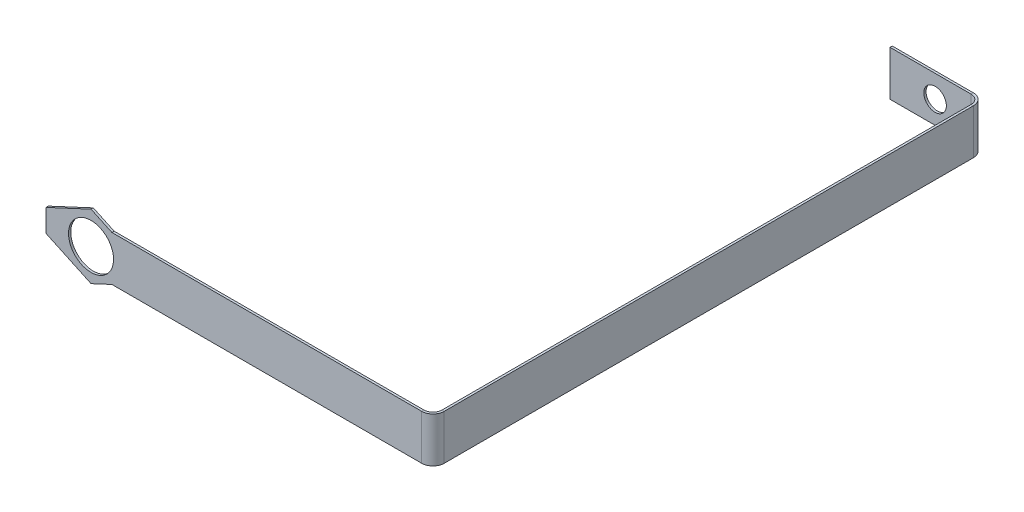
ISO-10303-21;
HEADER;
FILE_DESCRIPTION(('STEP AP214'),'2;1');
FILE_NAME('part.step','',(''),(''),'','','');
FILE_SCHEMA(('AUTOMOTIVE_DESIGN { 1 0 10303 214 1 1 1 1 }'));
ENDSEC;
DATA;
#1=APPLICATION_CONTEXT('core data for automotive mechanical design processes');
#2=APPLICATION_PROTOCOL_DEFINITION('international standard','automotive_design',2000,#1);
#3=PRODUCT_CONTEXT('',#1,'mechanical');
#4=PRODUCT('Part','Part','',(#3));
#5=PRODUCT_RELATED_PRODUCT_CATEGORY('part','',(#4));
#6=PRODUCT_DEFINITION_FORMATION('','',#4);
#7=PRODUCT_DEFINITION_CONTEXT('part definition',#1,'design');
#8=PRODUCT_DEFINITION('design','',#6,#7);
#9=PRODUCT_DEFINITION_SHAPE('','',#8);
#10=(LENGTH_UNIT() NAMED_UNIT(*) SI_UNIT(.MILLI.,.METRE.));
#11=(NAMED_UNIT(*) PLANE_ANGLE_UNIT() SI_UNIT($,.RADIAN.));
#12=(NAMED_UNIT(*) SI_UNIT($,.STERADIAN.) SOLID_ANGLE_UNIT());
#13=UNCERTAINTY_MEASURE_WITH_UNIT(LENGTH_MEASURE(1.E-05),#10,'distance_accuracy_value','');
#14=(GEOMETRIC_REPRESENTATION_CONTEXT(3) GLOBAL_UNCERTAINTY_ASSIGNED_CONTEXT((#13)) GLOBAL_UNIT_ASSIGNED_CONTEXT((#10,
#11,#12)) REPRESENTATION_CONTEXT('',''));
#15=CARTESIAN_POINT('',(0.,0.,0.));
#16=DIRECTION('',(0.,0.,1.));
#17=DIRECTION('',(1.,0.,0.));
#18=AXIS2_PLACEMENT_3D('',#15,#16,#17);
#19=CARTESIAN_POINT('',(8.20000000000001,4.,49.));
#20=DIRECTION('',(0.,1.,0.));
#21=DIRECTION('',(1.,0.,0.));
#22=AXIS2_PLACEMENT_3D('',#19,#20,#21);
#23=PLANE('',#22);
#24=DIRECTION('',(-1.,0.,0.));
#25=VECTOR('',#24,1.);
#26=CARTESIAN_POINT('',(8.20000000000001,4.,48.8));
#27=LINE('',#26,#25);
#28=CARTESIAN_POINT('',(-20.3145069205096,4.,48.8));
#29=VERTEX_POINT('',#28);
#30=CARTESIAN_POINT('',(7.2,4.,48.8));
#31=VERTEX_POINT('',#30);
#32=EDGE_CURVE('E68',#29,#31,#27,.F.);
#33=ORIENTED_EDGE('',*,*,#32,.F.);
#34=DIRECTION('',(0.,0.,1.));
#35=VECTOR('',#34,1.);
#36=CARTESIAN_POINT('',(-20.3145069205096,4.,48.8));
#37=LINE('',#36,#35);
#38=CARTESIAN_POINT('',(-20.3145069205096,4.,49.));
#39=VERTEX_POINT('',#38);
#40=EDGE_CURVE('E192',#29,#39,#37,.T.);
#41=ORIENTED_EDGE('',*,*,#40,.T.);
#42=DIRECTION('',(1.,0.,0.));
#43=VECTOR('',#42,1.);
#44=CARTESIAN_POINT('',(8.20000000000001,4.,49.));
#45=LINE('',#44,#43);
#46=CARTESIAN_POINT('',(7.2,4.,49.));
#47=VERTEX_POINT('',#46);
#48=EDGE_CURVE('E266',#39,#47,#45,.T.);
#49=ORIENTED_EDGE('',*,*,#48,.T.);
#50=DIRECTION('',(0.,0.,1.));
#51=VECTOR('',#50,1.);
#52=CARTESIAN_POINT('',(7.2,4.,49.));
#53=LINE('',#52,#51);
#54=EDGE_CURVE('E285',#31,#47,#53,.T.);
#55=ORIENTED_EDGE('',*,*,#54,.F.);
#56=EDGE_LOOP('',(#33,#41,#49,#55));
#57=FACE_BOUND('',#56,.T.);
#58=ADVANCED_FACE('F53',(#57),#23,.T.);
#59=CARTESIAN_POINT('',(8.2,0.,0.));
#60=DIRECTION('',(0.,1.,0.));
#61=DIRECTION('',(0.,0.,-1.));
#62=AXIS2_PLACEMENT_3D('',#59,#60,#61);
#63=PLANE('',#62);
#64=DIRECTION('',(1.,0.,0.));
#65=VECTOR('',#64,1.);
#66=CARTESIAN_POINT('',(8.2,0.,48.));
#67=LINE('',#66,#65);
#68=CARTESIAN_POINT('',(8.,0.,48.));
#69=VERTEX_POINT('',#68);
#70=CARTESIAN_POINT('',(8.2,0.,48.));
#71=VERTEX_POINT('',#70);
#72=EDGE_CURVE('E318',#69,#71,#67,.T.);
#73=ORIENTED_EDGE('',*,*,#72,.F.);
#74=DIRECTION('',(0.,0.,1.));
#75=VECTOR('',#74,1.);
#76=CARTESIAN_POINT('',(8.,0.,0.));
#77=LINE('',#76,#75);
#78=CARTESIAN_POINT('',(8.,0.,1.));
#79=VERTEX_POINT('',#78);
#80=EDGE_CURVE('E297',#69,#79,#77,.F.);
#81=ORIENTED_EDGE('',*,*,#80,.T.);
#82=DIRECTION('',(1.,0.,0.));
#83=VECTOR('',#82,1.);
#84=CARTESIAN_POINT('',(8.2,0.,1.));
#85=LINE('',#84,#83);
#86=CARTESIAN_POINT('',(8.2,0.,1.));
#87=VERTEX_POINT('',#86);
#88=EDGE_CURVE('E324',#79,#87,#85,.T.);
#89=ORIENTED_EDGE('',*,*,#88,.T.);
#90=DIRECTION('',(0.,0.,-1.));
#91=VECTOR('',#90,1.);
#92=CARTESIAN_POINT('',(8.2,0.,0.));
#93=LINE('',#92,#91);
#94=EDGE_CURVE('E302',#71,#87,#93,.T.);
#95=ORIENTED_EDGE('',*,*,#94,.F.);
#96=EDGE_LOOP('',(#73,#81,#89,#95));
#97=FACE_BOUND('',#96,.T.);
#98=ADVANCED_FACE('F55',(#97),#63,.F.);
#99=CARTESIAN_POINT('',(8.2,4.,0.));
#100=DIRECTION('',(0.,1.,0.));
#101=DIRECTION('',(0.,0.,-1.));
#102=AXIS2_PLACEMENT_3D('',#99,#100,#101);
#103=PLANE('',#102);
#104=DIRECTION('',(1.,0.,0.));
#105=VECTOR('',#104,1.);
#106=CARTESIAN_POINT('',(8.2,4.,1.));
#107=LINE('',#106,#105);
#108=CARTESIAN_POINT('',(8.,4.,1.));
#109=VERTEX_POINT('',#108);
#110=CARTESIAN_POINT('',(8.2,4.,1.));
#111=VERTEX_POINT('',#110);
#112=EDGE_CURVE('E11',#109,#111,#107,.T.);
#113=ORIENTED_EDGE('',*,*,#112,.F.);
#114=DIRECTION('',(0.,0.,1.));
#115=VECTOR('',#114,1.);
#116=CARTESIAN_POINT('',(8.,4.,0.));
#117=LINE('',#116,#115);
#118=CARTESIAN_POINT('',(8.,4.,48.));
#119=VERTEX_POINT('',#118);
#120=EDGE_CURVE('E305',#119,#109,#117,.F.);
#121=ORIENTED_EDGE('',*,*,#120,.F.);
#122=DIRECTION('',(1.,0.,0.));
#123=VECTOR('',#122,1.);
#124=CARTESIAN_POINT('',(8.2,4.,48.));
#125=LINE('',#124,#123);
#126=CARTESIAN_POINT('',(8.2,4.,48.));
#127=VERTEX_POINT('',#126);
#128=EDGE_CURVE('E312',#119,#127,#125,.T.);
#129=ORIENTED_EDGE('',*,*,#128,.T.);
#130=DIRECTION('',(0.,0.,-1.));
#131=VECTOR('',#130,1.);
#132=CARTESIAN_POINT('',(8.2,4.,0.));
#133=LINE('',#132,#131);
#134=EDGE_CURVE('E304',#127,#111,#133,.T.);
#135=ORIENTED_EDGE('',*,*,#134,.T.);
#136=EDGE_LOOP('',(#113,#121,#129,#135));
#137=FACE_BOUND('',#136,.T.);
#138=ADVANCED_FACE('F365',(#137),#103,.T.);
#139=CARTESIAN_POINT('',(8.2,4.,0.));
#140=DIRECTION('',(-1.,0.,0.));
#141=DIRECTION('',(0.,0.,1.));
#142=AXIS2_PLACEMENT_3D('',#139,#140,#141);
#143=PLANE('',#142);
#144=ORIENTED_EDGE('',*,*,#94,.T.);
#145=DIRECTION('',(0.,1.,0.));
#146=VECTOR('',#145,1.);
#147=CARTESIAN_POINT('',(8.2,4.,1.));
#148=LINE('',#147,#146);
#149=EDGE_CURVE('E321',#87,#111,#148,.T.);
#150=ORIENTED_EDGE('',*,*,#149,.T.);
#151=ORIENTED_EDGE('',*,*,#134,.F.);
#152=DIRECTION('',(0.,-1.,0.));
#153=VECTOR('',#152,1.);
#154=CARTESIAN_POINT('',(8.2,4.,48.));
#155=LINE('',#154,#153);
#156=EDGE_CURVE('E307',#127,#71,#155,.T.);
#157=ORIENTED_EDGE('',*,*,#156,.T.);
#158=EDGE_LOOP('',(#144,#150,#151,#157));
#159=FACE_BOUND('',#158,.T.);
#160=ADVANCED_FACE('F369',(#159),#143,.F.);
#161=CARTESIAN_POINT('',(8.,4.,0.));
#162=DIRECTION('',(-1.,0.,0.));
#163=DIRECTION('',(0.,0.,1.));
#164=AXIS2_PLACEMENT_3D('',#161,#162,#163);
#165=PLANE('',#164);
#166=ORIENTED_EDGE('',*,*,#80,.F.);
#167=DIRECTION('',(0.,-1.,0.));
#168=VECTOR('',#167,1.);
#169=CARTESIAN_POINT('',(8.,4.,48.));
#170=LINE('',#169,#168);
#171=EDGE_CURVE('E315',#119,#69,#170,.T.);
#172=ORIENTED_EDGE('',*,*,#171,.F.);
#173=ORIENTED_EDGE('',*,*,#120,.T.);
#174=DIRECTION('',(0.,1.,0.));
#175=VECTOR('',#174,1.);
#176=CARTESIAN_POINT('',(8.,4.,1.));
#177=LINE('',#176,#175);
#178=EDGE_CURVE('E61',#79,#109,#177,.T.);
#179=ORIENTED_EDGE('',*,*,#178,.F.);
#180=EDGE_LOOP('',(#166,#172,#173,#179));
#181=FACE_BOUND('',#180,.T.);
#182=ADVANCED_FACE('F334',(#181),#165,.T.);
#183=CARTESIAN_POINT('',(7.2,0.,48.));
#184=DIRECTION('',(0.,-1.,0.));
#185=DIRECTION('',(0.,0.,-1.));
#186=AXIS2_PLACEMENT_3D('',#183,#184,#185);
#187=PLANE('',#186);
#188=DIRECTION('',(0.,0.,1.));
#189=VECTOR('',#188,1.);
#190=CARTESIAN_POINT('',(7.2,0.,49.));
#191=LINE('',#190,#189);
#192=CARTESIAN_POINT('',(7.2,0.,48.8));
#193=VERTEX_POINT('',#192);
#194=CARTESIAN_POINT('',(7.2,0.,49.));
#195=VERTEX_POINT('',#194);
#196=EDGE_CURVE('E259',#193,#195,#191,.T.);
#197=ORIENTED_EDGE('',*,*,#196,.F.);
#198=CARTESIAN_POINT('',(7.2,0.,48.));
#199=DIRECTION('',(0.,-1.,0.));
#200=DIRECTION('',(0.,0.,-1.));
#201=AXIS2_PLACEMENT_3D('',#198,#199,#200);
#202=CIRCLE('',#201,0.8);
#203=EDGE_CURVE('E262',#193,#69,#202,.F.);
#204=ORIENTED_EDGE('',*,*,#203,.T.);
#205=ORIENTED_EDGE('',*,*,#72,.T.);
#206=CARTESIAN_POINT('',(7.2,0.,48.));
#207=DIRECTION('',(0.,1.,0.));
#208=DIRECTION('',(0.,0.,1.));
#209=AXIS2_PLACEMENT_3D('',#206,#207,#208);
#210=CIRCLE('',#209,1.);
#211=EDGE_CURVE('E290',#195,#71,#210,.T.);
#212=ORIENTED_EDGE('',*,*,#211,.F.);
#213=EDGE_LOOP('',(#197,#204,#205,#212));
#214=FACE_BOUND('',#213,.T.);
#215=ADVANCED_FACE('F351',(#214),#187,.T.);
#216=CARTESIAN_POINT('',(7.2,4.,48.));
#217=DIRECTION('',(0.,1.,0.));
#218=DIRECTION('',(0.,0.,1.));
#219=AXIS2_PLACEMENT_3D('',#216,#217,#218);
#220=PLANE('',#219);
#221=ORIENTED_EDGE('',*,*,#128,.F.);
#222=CARTESIAN_POINT('',(7.2,4.,48.));
#223=DIRECTION('',(0.,-1.,0.));
#224=DIRECTION('',(0.,0.,-1.));
#225=AXIS2_PLACEMENT_3D('',#222,#223,#224);
#226=CIRCLE('',#225,0.8);
#227=EDGE_CURVE('E294',#119,#31,#226,.T.);
#228=ORIENTED_EDGE('',*,*,#227,.T.);
#229=ORIENTED_EDGE('',*,*,#54,.T.);
#230=CARTESIAN_POINT('',(7.2,4.,48.));
#231=DIRECTION('',(0.,-1.,0.));
#232=DIRECTION('',(0.,0.,-1.));
#233=AXIS2_PLACEMENT_3D('',#230,#231,#232);
#234=CIRCLE('',#233,1.);
#235=EDGE_CURVE('E293',#127,#47,#234,.T.);
#236=ORIENTED_EDGE('',*,*,#235,.F.);
#237=EDGE_LOOP('',(#221,#228,#229,#236));
#238=FACE_BOUND('',#237,.T.);
#239=ADVANCED_FACE('F362',(#238),#220,.T.);
#240=CARTESIAN_POINT('',(7.2,6.24718670312721,48.));
#241=DIRECTION('',(0.,-1.,0.));
#242=DIRECTION('',(0.,0.,-1.));
#243=AXIS2_PLACEMENT_3D('',#240,#241,#242);
#244=CYLINDRICAL_SURFACE('',#243,1.);
#245=ORIENTED_EDGE('',*,*,#235,.T.);
#246=DIRECTION('',(0.,1.,0.));
#247=VECTOR('',#246,1.);
#248=CARTESIAN_POINT('',(7.2,4.,49.));
#249=LINE('',#248,#247);
#250=EDGE_CURVE('E268',#195,#47,#249,.T.);
#251=ORIENTED_EDGE('',*,*,#250,.F.);
#252=ORIENTED_EDGE('',*,*,#211,.T.);
#253=ORIENTED_EDGE('',*,*,#156,.F.);
#254=EDGE_LOOP('',(#245,#251,#252,#253));
#255=FACE_BOUND('',#254,.T.);
#256=ADVANCED_FACE('F367',(#255),#244,.T.);
#257=CARTESIAN_POINT('',(7.2,6.24718670312721,48.));
#258=DIRECTION('',(0.,-1.,0.));
#259=DIRECTION('',(0.,0.,-1.));
#260=AXIS2_PLACEMENT_3D('',#257,#258,#259);
#261=CYLINDRICAL_SURFACE('',#260,0.8);
#262=ORIENTED_EDGE('',*,*,#227,.F.);
#263=ORIENTED_EDGE('',*,*,#171,.T.);
#264=ORIENTED_EDGE('',*,*,#203,.F.);
#265=DIRECTION('',(0.,1.,0.));
#266=VECTOR('',#265,1.);
#267=CARTESIAN_POINT('',(7.2,4.,48.8));
#268=LINE('',#267,#266);
#269=EDGE_CURVE('E254',#193,#31,#268,.T.);
#270=ORIENTED_EDGE('',*,*,#269,.T.);
#271=EDGE_LOOP('',(#262,#263,#264,#270));
#272=FACE_BOUND('',#271,.T.);
#273=ADVANCED_FACE('F348',(#272),#261,.F.);
#274=CARTESIAN_POINT('',(-26.17,1.,49.));
#275=DIRECTION('',(-0.422618261740694,-0.906307787036653,0.));
#276=DIRECTION('',(-0.906307787036653,0.422618261740694,0.));
#277=AXIS2_PLACEMENT_3D('',#274,#275,#276);
#278=PLANE('',#277);
#279=DIRECTION('',(0.,0.,1.));
#280=VECTOR('',#279,1.);
#281=CARTESIAN_POINT('',(-26.17,1.,49.));
#282=LINE('',#281,#280);
#283=CARTESIAN_POINT('',(-26.17,1.,48.8));
#284=VERTEX_POINT('',#283);
#285=CARTESIAN_POINT('',(-26.17,1.,49.));
#286=VERTEX_POINT('',#285);
#287=EDGE_CURVE('E279',#284,#286,#282,.T.);
#288=ORIENTED_EDGE('',*,*,#287,.F.);
#289=DIRECTION('',(-0.906307787036653,0.422618261740694,0.));
#290=VECTOR('',#289,1.);
#291=CARTESIAN_POINT('',(-26.17,1.,48.8));
#292=LINE('',#291,#290);
#293=CARTESIAN_POINT('',(-22.17,-0.865230632619958,48.8));
#294=VERTEX_POINT('',#293);
#295=EDGE_CURVE('E178',#294,#284,#292,.T.);
#296=ORIENTED_EDGE('',*,*,#295,.F.);
#297=DIRECTION('',(0.,0.,1.));
#298=VECTOR('',#297,1.);
#299=CARTESIAN_POINT('',(-22.17,-0.865230632619958,48.8));
#300=LINE('',#299,#298);
#301=CARTESIAN_POINT('',(-22.17,-0.865230632619958,49.));
#302=VERTEX_POINT('',#301);
#303=EDGE_CURVE('E188',#294,#302,#300,.T.);
#304=ORIENTED_EDGE('',*,*,#303,.T.);
#305=DIRECTION('',(-0.906307787036653,0.422618261740694,0.));
#306=VECTOR('',#305,1.);
#307=CARTESIAN_POINT('',(-26.17,1.,49.));
#308=LINE('',#307,#306);
#309=EDGE_CURVE('E282',#302,#286,#308,.T.);
#310=ORIENTED_EDGE('',*,*,#309,.T.);
#311=EDGE_LOOP('',(#288,#296,#304,#310));
#312=FACE_BOUND('',#311,.T.);
#313=ADVANCED_FACE('F424',(#312),#278,.T.);
#314=CARTESIAN_POINT('',(-26.17,4.,49.));
#315=DIRECTION('',(1.,0.,0.));
#316=DIRECTION('',(0.,-1.,0.));
#317=AXIS2_PLACEMENT_3D('',#314,#315,#316);
#318=PLANE('',#317);
#319=DIRECTION('',(0.,0.,1.));
#320=VECTOR('',#319,1.);
#321=CARTESIAN_POINT('',(-26.17,3.,49.));
#322=LINE('',#321,#320);
#323=CARTESIAN_POINT('',(-26.17,3.,48.8));
#324=VERTEX_POINT('',#323);
#325=CARTESIAN_POINT('',(-26.17,3.,49.));
#326=VERTEX_POINT('',#325);
#327=EDGE_CURVE('E277',#324,#326,#322,.T.);
#328=ORIENTED_EDGE('',*,*,#327,.F.);
#329=DIRECTION('',(0.,1.,0.));
#330=VECTOR('',#329,1.);
#331=CARTESIAN_POINT('',(-26.17,4.,48.8));
#332=LINE('',#331,#330);
#333=EDGE_CURVE('E175',#324,#284,#332,.F.);
#334=ORIENTED_EDGE('',*,*,#333,.T.);
#335=ORIENTED_EDGE('',*,*,#287,.T.);
#336=DIRECTION('',(0.,-1.,0.));
#337=VECTOR('',#336,1.);
#338=CARTESIAN_POINT('',(-26.17,4.,49.));
#339=LINE('',#338,#337);
#340=EDGE_CURVE('E273',#326,#286,#339,.T.);
#341=ORIENTED_EDGE('',*,*,#340,.F.);
#342=EDGE_LOOP('',(#328,#334,#335,#341));
#343=FACE_BOUND('',#342,.T.);
#344=ADVANCED_FACE('F451',(#343),#318,.F.);
#345=CARTESIAN_POINT('',(-26.17,3.,49.));
#346=DIRECTION('',(-0.422618261740694,0.906307787036653,0.));
#347=DIRECTION('',(0.906307787036653,0.422618261740694,0.));
#348=AXIS2_PLACEMENT_3D('',#345,#346,#347);
#349=PLANE('',#348);
#350=DIRECTION('',(0.906307787036653,0.422618261740694,0.));
#351=VECTOR('',#350,1.);
#352=CARTESIAN_POINT('',(-26.17,3.,49.));
#353=LINE('',#352,#351);
#354=CARTESIAN_POINT('',(-22.17,4.86523063261996,49.));
#355=VERTEX_POINT('',#354);
#356=EDGE_CURVE('E184',#326,#355,#353,.T.);
#357=ORIENTED_EDGE('',*,*,#356,.T.);
#358=DIRECTION('',(0.,0.,1.));
#359=VECTOR('',#358,1.);
#360=CARTESIAN_POINT('',(-22.17,4.86523063261996,48.8));
#361=LINE('',#360,#359);
#362=CARTESIAN_POINT('',(-22.17,4.86523063261996,48.8));
#363=VERTEX_POINT('',#362);
#364=EDGE_CURVE('E181',#363,#355,#361,.T.);
#365=ORIENTED_EDGE('',*,*,#364,.F.);
#366=DIRECTION('',(0.906307787036653,0.422618261740694,0.));
#367=VECTOR('',#366,1.);
#368=CARTESIAN_POINT('',(-26.17,3.,48.8));
#369=LINE('',#368,#367);
#370=EDGE_CURVE('E167',#324,#363,#369,.T.);
#371=ORIENTED_EDGE('',*,*,#370,.F.);
#372=ORIENTED_EDGE('',*,*,#327,.T.);
#373=EDGE_LOOP('',(#357,#365,#371,#372));
#374=FACE_BOUND('',#373,.T.);
#375=ADVANCED_FACE('F182',(#374),#349,.T.);
#376=CARTESIAN_POINT('',(8.20000000000001,4.,49.));
#377=DIRECTION('',(0.,0.,-1.));
#378=DIRECTION('',(-1.,0.,0.));
#379=AXIS2_PLACEMENT_3D('',#376,#377,#378);
#380=PLANE('',#379);
#381=CARTESIAN_POINT('',(-22.17,2.,49.));
#382=DIRECTION('',(0.,0.,1.));
#383=DIRECTION('',(1.,0.,0.));
#384=AXIS2_PLACEMENT_3D('',#381,#382,#383);
#385=CIRCLE('',#384,2.);
#386=CARTESIAN_POINT('',(-20.17,2.,49.));
#387=VERTEX_POINT('',#386);
#388=EDGE_CURVE('E198',#387,#387,#385,.T.);
#389=ORIENTED_EDGE('',*,*,#388,.F.);
#390=EDGE_LOOP('',(#389));
#391=FACE_BOUND('',#390,.T.);
#392=ORIENTED_EDGE('',*,*,#309,.F.);
#393=DIRECTION('',(0.90630778703665,0.4226182617407,0.));
#394=VECTOR('',#393,1.);
#395=CARTESIAN_POINT('',(-3.6282967875573,7.78090757057923,49.));
#396=LINE('',#395,#394);
#397=CARTESIAN_POINT('',(-20.3145069205096,0.,49.));
#398=VERTEX_POINT('',#397);
#399=EDGE_CURVE('E76',#302,#398,#396,.T.);
#400=ORIENTED_EDGE('',*,*,#399,.T.);
#401=DIRECTION('',(1.,0.,0.));
#402=VECTOR('',#401,1.);
#403=CARTESIAN_POINT('',(8.20000000000001,0.,49.));
#404=LINE('',#403,#402);
#405=EDGE_CURVE('E271',#398,#195,#404,.T.);
#406=ORIENTED_EDGE('',*,*,#405,.T.);
#407=ORIENTED_EDGE('',*,*,#250,.T.);
#408=ORIENTED_EDGE('',*,*,#48,.F.);
#409=DIRECTION('',(0.90630778703665,-0.4226182617407,0.));
#410=VECTOR('',#409,1.);
#411=CARTESIAN_POINT('',(-2.09620790131935,-4.49533235120615,49.));
#412=LINE('',#411,#410);
#413=EDGE_CURVE('E195',#355,#39,#412,.T.);
#414=ORIENTED_EDGE('',*,*,#413,.F.);
#415=ORIENTED_EDGE('',*,*,#356,.F.);
#416=ORIENTED_EDGE('',*,*,#340,.T.);
#417=EDGE_LOOP('',(#392,#400,#406,#407,#408,#414,#415,#416));
#418=FACE_BOUND('',#417,.T.);
#419=ADVANCED_FACE('F413',(#391,#418),#380,.F.);
#420=CARTESIAN_POINT('',(8.20000000000001,4.,48.8));
#421=DIRECTION('',(0.,0.,-1.));
#422=DIRECTION('',(-1.,0.,0.));
#423=AXIS2_PLACEMENT_3D('',#420,#421,#422);
#424=PLANE('',#423);
#425=CARTESIAN_POINT('',(-22.17,2.,48.8));
#426=DIRECTION('',(0.,0.,1.));
#427=DIRECTION('',(1.,0.,0.));
#428=AXIS2_PLACEMENT_3D('',#425,#426,#427);
#429=CIRCLE('',#428,2.);
#430=CARTESIAN_POINT('',(-20.17,2.,48.8));
#431=VERTEX_POINT('',#430);
#432=EDGE_CURVE('E201',#431,#431,#429,.T.);
#433=ORIENTED_EDGE('',*,*,#432,.T.);
#434=EDGE_LOOP('',(#433));
#435=FACE_BOUND('',#434,.T.);
#436=ORIENTED_EDGE('',*,*,#370,.T.);
#437=DIRECTION('',(0.90630778703665,-0.4226182617407,0.));
#438=VECTOR('',#437,1.);
#439=CARTESIAN_POINT('',(-2.09620790131935,-4.49533235120615,48.8));
#440=LINE('',#439,#438);
#441=EDGE_CURVE('E171',#363,#29,#440,.T.);
#442=ORIENTED_EDGE('',*,*,#441,.T.);
#443=ORIENTED_EDGE('',*,*,#32,.T.);
#444=ORIENTED_EDGE('',*,*,#269,.F.);
#445=DIRECTION('',(-1.,0.,0.));
#446=VECTOR('',#445,1.);
#447=CARTESIAN_POINT('',(8.20000000000001,0.,48.8));
#448=LINE('',#447,#446);
#449=CARTESIAN_POINT('',(-20.3145069205096,0.,48.8));
#450=VERTEX_POINT('',#449);
#451=EDGE_CURVE('E177',#450,#193,#448,.F.);
#452=ORIENTED_EDGE('',*,*,#451,.F.);
#453=DIRECTION('',(0.90630778703665,0.4226182617407,0.));
#454=VECTOR('',#453,1.);
#455=CARTESIAN_POINT('',(-3.6282967875573,7.78090757057923,48.8));
#456=LINE('',#455,#454);
#457=EDGE_CURVE('E189',#294,#450,#456,.T.);
#458=ORIENTED_EDGE('',*,*,#457,.F.);
#459=ORIENTED_EDGE('',*,*,#295,.T.);
#460=ORIENTED_EDGE('',*,*,#333,.F.);
#461=EDGE_LOOP('',(#436,#442,#443,#444,#452,#458,#459,#460));
#462=FACE_BOUND('',#461,.T.);
#463=ADVANCED_FACE('F169',(#435,#462),#424,.T.);
#464=CARTESIAN_POINT('',(8.20000000000001,0.,49.));
#465=DIRECTION('',(0.,1.,0.));
#466=DIRECTION('',(1.,0.,0.));
#467=AXIS2_PLACEMENT_3D('',#464,#465,#466);
#468=PLANE('',#467);
#469=DIRECTION('',(0.,0.,1.));
#470=VECTOR('',#469,1.);
#471=CARTESIAN_POINT('',(-20.3145069205096,0.,48.8));
#472=LINE('',#471,#470);
#473=EDGE_CURVE('E205',#450,#398,#472,.T.);
#474=ORIENTED_EDGE('',*,*,#473,.F.);
#475=ORIENTED_EDGE('',*,*,#451,.T.);
#476=ORIENTED_EDGE('',*,*,#196,.T.);
#477=ORIENTED_EDGE('',*,*,#405,.F.);
#478=EDGE_LOOP('',(#474,#475,#476,#477));
#479=FACE_BOUND('',#478,.T.);
#480=ADVANCED_FACE('F356',(#479),#468,.F.);
#481=CARTESIAN_POINT('',(7.2,0.,1.));
#482=DIRECTION('',(0.,-1.,0.));
#483=DIRECTION('',(0.,0.,-1.));
#484=AXIS2_PLACEMENT_3D('',#481,#482,#483);
#485=PLANE('',#484);
#486=ORIENTED_EDGE('',*,*,#88,.F.);
#487=CARTESIAN_POINT('',(7.2,0.,1.));
#488=DIRECTION('',(0.,1.,0.));
#489=DIRECTION('',(0.,0.,1.));
#490=AXIS2_PLACEMENT_3D('',#487,#488,#489);
#491=CIRCLE('',#490,0.8);
#492=CARTESIAN_POINT('',(7.2,0.,0.199999999999999));
#493=VERTEX_POINT('',#492);
#494=EDGE_CURVE('E212',#79,#493,#491,.T.);
#495=ORIENTED_EDGE('',*,*,#494,.T.);
#496=DIRECTION('',(0.,0.,-1.));
#497=VECTOR('',#496,1.);
#498=CARTESIAN_POINT('',(7.2,0.,0.));
#499=LINE('',#498,#497);
#500=CARTESIAN_POINT('',(7.2,0.,0.));
#501=VERTEX_POINT('',#500);
#502=EDGE_CURVE('E242',#493,#501,#499,.T.);
#503=ORIENTED_EDGE('',*,*,#502,.T.);
#504=CARTESIAN_POINT('',(7.2,0.,1.));
#505=DIRECTION('',(0.,1.,0.));
#506=DIRECTION('',(0.,0.,1.));
#507=AXIS2_PLACEMENT_3D('',#504,#505,#506);
#508=CIRCLE('',#507,1.);
#509=EDGE_CURVE('E247',#87,#501,#508,.T.);
#510=ORIENTED_EDGE('',*,*,#509,.F.);
#511=EDGE_LOOP('',(#486,#495,#503,#510));
#512=FACE_BOUND('',#511,.T.);
#513=ADVANCED_FACE('F340',(#512),#485,.T.);
#514=CARTESIAN_POINT('',(7.2,4.,1.));
#515=DIRECTION('',(0.,1.,0.));
#516=DIRECTION('',(0.,0.,1.));
#517=AXIS2_PLACEMENT_3D('',#514,#515,#516);
#518=PLANE('',#517);
#519=DIRECTION('',(0.,0.,-1.));
#520=VECTOR('',#519,1.);
#521=CARTESIAN_POINT('',(7.2,4.,0.));
#522=LINE('',#521,#520);
#523=CARTESIAN_POINT('',(7.2,4.,0.199999999999999));
#524=VERTEX_POINT('',#523);
#525=CARTESIAN_POINT('',(7.2,4.,0.));
#526=VERTEX_POINT('',#525);
#527=EDGE_CURVE('E213',#524,#526,#522,.T.);
#528=ORIENTED_EDGE('',*,*,#527,.F.);
#529=CARTESIAN_POINT('',(7.2,4.,1.));
#530=DIRECTION('',(0.,1.,0.));
#531=DIRECTION('',(0.,0.,1.));
#532=AXIS2_PLACEMENT_3D('',#529,#530,#531);
#533=CIRCLE('',#532,0.8);
#534=EDGE_CURVE('E251',#524,#109,#533,.F.);
#535=ORIENTED_EDGE('',*,*,#534,.T.);
#536=ORIENTED_EDGE('',*,*,#112,.T.);
#537=CARTESIAN_POINT('',(7.2,4.,1.));
#538=DIRECTION('',(0.,-1.,0.));
#539=DIRECTION('',(0.,0.,-1.));
#540=AXIS2_PLACEMENT_3D('',#537,#538,#539);
#541=CIRCLE('',#540,1.);
#542=EDGE_CURVE('E250',#526,#111,#541,.T.);
#543=ORIENTED_EDGE('',*,*,#542,.F.);
#544=EDGE_LOOP('',(#528,#535,#536,#543));
#545=FACE_BOUND('',#544,.T.);
#546=ADVANCED_FACE('F374',(#545),#518,.T.);
#547=CARTESIAN_POINT('',(7.2,-2.24718670312721,1.));
#548=DIRECTION('',(0.,1.,0.));
#549=DIRECTION('',(0.,0.,1.));
#550=AXIS2_PLACEMENT_3D('',#547,#548,#549);
#551=CYLINDRICAL_SURFACE('',#550,1.);
#552=ORIENTED_EDGE('',*,*,#542,.T.);
#553=ORIENTED_EDGE('',*,*,#149,.F.);
#554=ORIENTED_EDGE('',*,*,#509,.T.);
#555=DIRECTION('',(0.,-1.,0.));
#556=VECTOR('',#555,1.);
#557=CARTESIAN_POINT('',(7.2,4.,0.));
#558=LINE('',#557,#556);
#559=EDGE_CURVE('E229',#526,#501,#558,.T.);
#560=ORIENTED_EDGE('',*,*,#559,.F.);
#561=EDGE_LOOP('',(#552,#553,#554,#560));
#562=FACE_BOUND('',#561,.T.);
#563=ADVANCED_FACE('F376',(#562),#551,.T.);
#564=CARTESIAN_POINT('',(7.2,-2.24718670312721,1.));
#565=DIRECTION('',(0.,1.,0.));
#566=DIRECTION('',(0.,0.,1.));
#567=AXIS2_PLACEMENT_3D('',#564,#565,#566);
#568=CYLINDRICAL_SURFACE('',#567,0.8);
#569=ORIENTED_EDGE('',*,*,#534,.F.);
#570=DIRECTION('',(0.,-1.,0.));
#571=VECTOR('',#570,1.);
#572=CARTESIAN_POINT('',(7.2,4.,0.199999999999999));
#573=LINE('',#572,#571);
#574=EDGE_CURVE('E204',#524,#493,#573,.T.);
#575=ORIENTED_EDGE('',*,*,#574,.T.);
#576=ORIENTED_EDGE('',*,*,#494,.F.);
#577=ORIENTED_EDGE('',*,*,#178,.T.);
#578=EDGE_LOOP('',(#569,#575,#576,#577));
#579=FACE_BOUND('',#578,.T.);
#580=ADVANCED_FACE('F331',(#579),#568,.F.);
#581=CARTESIAN_POINT('',(0.,4.,0.));
#582=DIRECTION('',(-1.,0.,0.));
#583=DIRECTION('',(0.,-1.,0.));
#584=AXIS2_PLACEMENT_3D('',#581,#582,#583);
#585=PLANE('',#584);
#586=DIRECTION('',(0.,0.,-1.));
#587=VECTOR('',#586,1.);
#588=CARTESIAN_POINT('',(0.,0.,0.));
#589=LINE('',#588,#587);
#590=CARTESIAN_POINT('',(0.,0.,0.200000000000001));
#591=VERTEX_POINT('',#590);
#592=CARTESIAN_POINT('',(0.,0.,0.));
#593=VERTEX_POINT('',#592);
#594=EDGE_CURVE('E221',#591,#593,#589,.T.);
#595=ORIENTED_EDGE('',*,*,#594,.F.);
#596=DIRECTION('',(0.,1.,0.));
#597=VECTOR('',#596,1.);
#598=CARTESIAN_POINT('',(0.,4.,0.200000000000001));
#599=LINE('',#598,#597);
#600=CARTESIAN_POINT('',(0.,4.,0.200000000000001));
#601=VERTEX_POINT('',#600);
#602=EDGE_CURVE('E215',#601,#591,#599,.F.);
#603=ORIENTED_EDGE('',*,*,#602,.F.);
#604=DIRECTION('',(0.,0.,-1.));
#605=VECTOR('',#604,1.);
#606=CARTESIAN_POINT('',(0.,4.,0.));
#607=LINE('',#606,#605);
#608=CARTESIAN_POINT('',(0.,4.,0.));
#609=VERTEX_POINT('',#608);
#610=EDGE_CURVE('E240',#601,#609,#607,.T.);
#611=ORIENTED_EDGE('',*,*,#610,.T.);
#612=DIRECTION('',(0.,-1.,0.));
#613=VECTOR('',#612,1.);
#614=CARTESIAN_POINT('',(0.,4.,0.));
#615=LINE('',#614,#613);
#616=EDGE_CURVE('E237',#609,#593,#615,.T.);
#617=ORIENTED_EDGE('',*,*,#616,.T.);
#618=EDGE_LOOP('',(#595,#603,#611,#617));
#619=FACE_BOUND('',#618,.T.);
#620=ADVANCED_FACE('F387',(#619),#585,.T.);
#621=CARTESIAN_POINT('',(4.,2.,0.));
#622=DIRECTION('',(0.,0.,1.));
#623=DIRECTION('',(1.,0.,0.));
#624=AXIS2_PLACEMENT_3D('',#621,#622,#623);
#625=CYLINDRICAL_SURFACE('',#624,1.);
#626=CARTESIAN_POINT('',(4.,2.,0.));
#627=DIRECTION('',(0.,0.,1.));
#628=DIRECTION('',(1.,0.,0.));
#629=AXIS2_PLACEMENT_3D('',#626,#627,#628);
#630=CIRCLE('',#629,1.);
#631=CARTESIAN_POINT('',(5.,2.,0.));
#632=VERTEX_POINT('',#631);
#633=EDGE_CURVE('E231',#632,#632,#630,.T.);
#634=ORIENTED_EDGE('',*,*,#633,.F.);
#635=EDGE_LOOP('',(#634));
#636=FACE_BOUND('',#635,.T.);
#637=CARTESIAN_POINT('',(4.,2.,0.200000000000001));
#638=DIRECTION('',(0.,0.,1.));
#639=DIRECTION('',(1.,0.,0.));
#640=AXIS2_PLACEMENT_3D('',#637,#638,#639);
#641=CIRCLE('',#640,1.);
#642=CARTESIAN_POINT('',(5.,2.,0.200000000000001));
#643=VERTEX_POINT('',#642);
#644=EDGE_CURVE('E234',#643,#643,#641,.T.);
#645=ORIENTED_EDGE('',*,*,#644,.T.);
#646=EDGE_LOOP('',(#645));
#647=FACE_BOUND('',#646,.T.);
#648=ADVANCED_FACE('F486',(#636,#647),#625,.F.);
#649=CARTESIAN_POINT('',(0.,4.,0.));
#650=DIRECTION('',(0.,0.,1.));
#651=DIRECTION('',(1.,0.,0.));
#652=AXIS2_PLACEMENT_3D('',#649,#650,#651);
#653=PLANE('',#652);
#654=ORIENTED_EDGE('',*,*,#633,.T.);
#655=EDGE_LOOP('',(#654));
#656=FACE_BOUND('',#655,.T.);
#657=DIRECTION('',(-1.,0.,0.));
#658=VECTOR('',#657,1.);
#659=CARTESIAN_POINT('',(0.,4.,0.));
#660=LINE('',#659,#658);
#661=EDGE_CURVE('E209',#526,#609,#660,.T.);
#662=ORIENTED_EDGE('',*,*,#661,.F.);
#663=ORIENTED_EDGE('',*,*,#559,.T.);
#664=DIRECTION('',(-1.,0.,0.));
#665=VECTOR('',#664,1.);
#666=CARTESIAN_POINT('',(0.,0.,0.));
#667=LINE('',#666,#665);
#668=EDGE_CURVE('E226',#501,#593,#667,.T.);
#669=ORIENTED_EDGE('',*,*,#668,.T.);
#670=ORIENTED_EDGE('',*,*,#616,.F.);
#671=EDGE_LOOP('',(#662,#663,#669,#670));
#672=FACE_BOUND('',#671,.T.);
#673=ADVANCED_FACE('F380',(#656,#672),#653,.F.);
#674=CARTESIAN_POINT('',(0.,0.,0.));
#675=DIRECTION('',(0.,1.,0.));
#676=DIRECTION('',(-1.,0.,0.));
#677=AXIS2_PLACEMENT_3D('',#674,#675,#676);
#678=PLANE('',#677);
#679=ORIENTED_EDGE('',*,*,#502,.F.);
#680=DIRECTION('',(1.,0.,0.));
#681=VECTOR('',#680,1.);
#682=CARTESIAN_POINT('',(0.,0.,0.200000000000001));
#683=LINE('',#682,#681);
#684=EDGE_CURVE('E223',#493,#591,#683,.F.);
#685=ORIENTED_EDGE('',*,*,#684,.T.);
#686=ORIENTED_EDGE('',*,*,#594,.T.);
#687=ORIENTED_EDGE('',*,*,#668,.F.);
#688=EDGE_LOOP('',(#679,#685,#686,#687));
#689=FACE_BOUND('',#688,.T.);
#690=ADVANCED_FACE('F384',(#689),#678,.F.);
#691=CARTESIAN_POINT('',(0.,4.,0.200000000000001));
#692=DIRECTION('',(0.,0.,1.));
#693=DIRECTION('',(1.,0.,0.));
#694=AXIS2_PLACEMENT_3D('',#691,#692,#693);
#695=PLANE('',#694);
#696=ORIENTED_EDGE('',*,*,#644,.F.);
#697=EDGE_LOOP('',(#696));
#698=FACE_BOUND('',#697,.T.);
#699=DIRECTION('',(1.,0.,0.));
#700=VECTOR('',#699,1.);
#701=CARTESIAN_POINT('',(0.,4.,0.200000000000001));
#702=LINE('',#701,#700);
#703=EDGE_CURVE('E218',#524,#601,#702,.F.);
#704=ORIENTED_EDGE('',*,*,#703,.T.);
#705=ORIENTED_EDGE('',*,*,#602,.T.);
#706=ORIENTED_EDGE('',*,*,#684,.F.);
#707=ORIENTED_EDGE('',*,*,#574,.F.);
#708=EDGE_LOOP('',(#704,#705,#706,#707));
#709=FACE_BOUND('',#708,.T.);
#710=ADVANCED_FACE('F389',(#698,#709),#695,.T.);
#711=CARTESIAN_POINT('',(0.,4.,0.));
#712=DIRECTION('',(0.,1.,0.));
#713=DIRECTION('',(-1.,0.,0.));
#714=AXIS2_PLACEMENT_3D('',#711,#712,#713);
#715=PLANE('',#714);
#716=ORIENTED_EDGE('',*,*,#610,.F.);
#717=ORIENTED_EDGE('',*,*,#703,.F.);
#718=ORIENTED_EDGE('',*,*,#527,.T.);
#719=ORIENTED_EDGE('',*,*,#661,.T.);
#720=EDGE_LOOP('',(#716,#717,#718,#719));
#721=FACE_BOUND('',#720,.T.);
#722=ADVANCED_FACE('F392',(#721),#715,.T.);
#723=CARTESIAN_POINT('',(-3.6282967875573,7.78090757057923,48.8));
#724=DIRECTION('',(0.4226182617407,-0.90630778703665,0.));
#725=DIRECTION('',(0.90630778703665,0.4226182617407,0.));
#726=AXIS2_PLACEMENT_3D('',#723,#724,#725);
#727=PLANE('',#726);
#728=ORIENTED_EDGE('',*,*,#399,.F.);
#729=ORIENTED_EDGE('',*,*,#303,.F.);
#730=ORIENTED_EDGE('',*,*,#457,.T.);
#731=ORIENTED_EDGE('',*,*,#473,.T.);
#732=EDGE_LOOP('',(#728,#729,#730,#731));
#733=FACE_BOUND('',#732,.T.);
#734=ADVANCED_FACE('F394',(#733),#727,.T.);
#735=CARTESIAN_POINT('',(-2.09620790131935,-4.49533235120615,48.8));
#736=DIRECTION('',(-0.4226182617407,-0.90630778703665,0.));
#737=DIRECTION('',(0.90630778703665,-0.4226182617407,0.));
#738=AXIS2_PLACEMENT_3D('',#735,#736,#737);
#739=PLANE('',#738);
#740=ORIENTED_EDGE('',*,*,#413,.T.);
#741=ORIENTED_EDGE('',*,*,#40,.F.);
#742=ORIENTED_EDGE('',*,*,#441,.F.);
#743=ORIENTED_EDGE('',*,*,#364,.T.);
#744=EDGE_LOOP('',(#740,#741,#742,#743));
#745=FACE_BOUND('',#744,.T.);
#746=ADVANCED_FACE('F191',(#745),#739,.F.);
#747=CARTESIAN_POINT('',(-22.17,2.,48.8));
#748=DIRECTION('',(0.,0.,1.));
#749=DIRECTION('',(1.,0.,0.));
#750=AXIS2_PLACEMENT_3D('',#747,#748,#749);
#751=CYLINDRICAL_SURFACE('',#750,2.);
#752=ORIENTED_EDGE('',*,*,#432,.F.);
#753=EDGE_LOOP('',(#752));
#754=FACE_BOUND('',#753,.T.);
#755=ORIENTED_EDGE('',*,*,#388,.T.);
#756=EDGE_LOOP('',(#755));
#757=FACE_BOUND('',#756,.T.);
#758=ADVANCED_FACE('F549',(#754,#757),#751,.F.);
#759=CLOSED_SHELL('',(#58,#98,#138,#160,#182,#215,#239,#256,#273,#313,#344,#375,#419,#463,#480,
#513,#546,#563,#580,#620,#648,#673,#690,#710,#722,#734,#746,#758));
#760=MANIFOLD_SOLID_BREP('B2',#759);
#761=ADVANCED_BREP_SHAPE_REPRESENTATION('',(#18,#760),#14);
#762=SHAPE_DEFINITION_REPRESENTATION(#9,#761);
ENDSEC;
END-ISO-10303-21;
